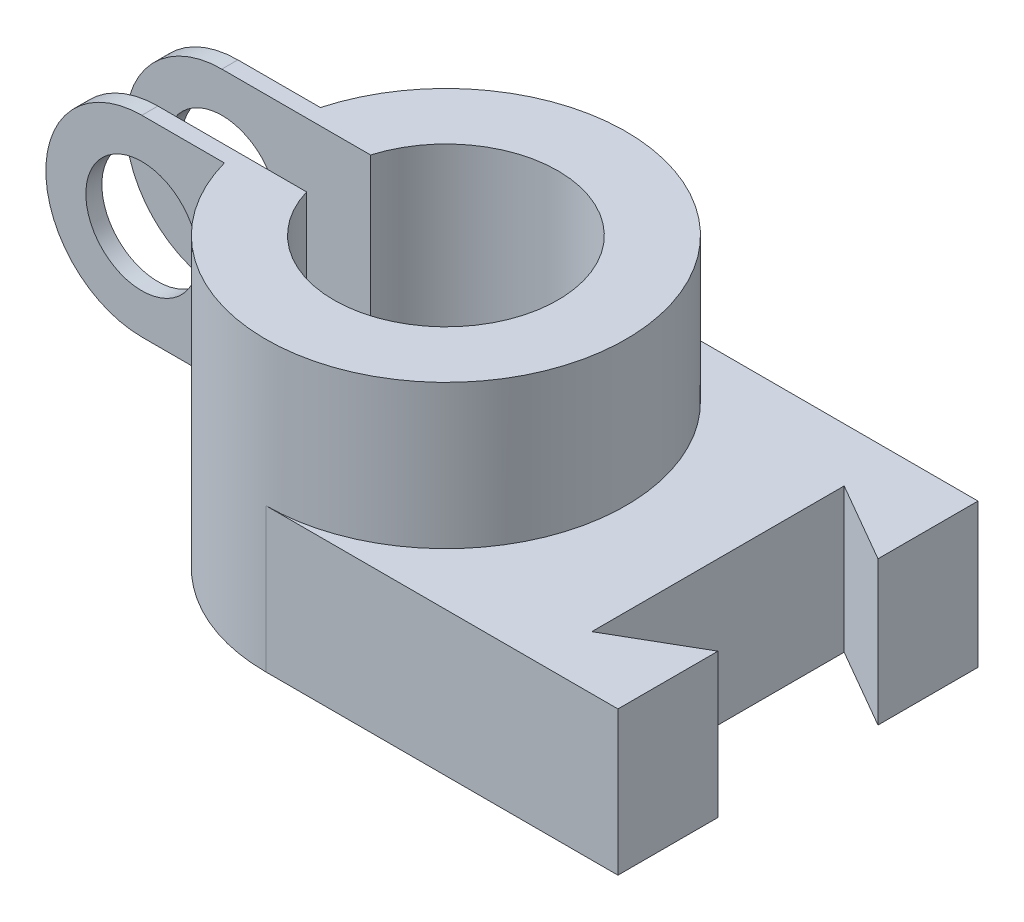
ISO-10303-21;
HEADER;
FILE_DESCRIPTION(('STEP AP214'),'2;1');
FILE_NAME('part.step','',(''),(''),'','','');
FILE_SCHEMA(('AUTOMOTIVE_DESIGN { 1 0 10303 214 1 1 1 1 }'));
ENDSEC;
DATA;
#1=APPLICATION_CONTEXT('core data for automotive mechanical design processes');
#2=APPLICATION_PROTOCOL_DEFINITION('international standard','automotive_design',2000,#1);
#3=PRODUCT_CONTEXT('',#1,'mechanical');
#4=PRODUCT('Part','Part','',(#3));
#5=PRODUCT_RELATED_PRODUCT_CATEGORY('part','',(#4));
#6=PRODUCT_DEFINITION_FORMATION('','',#4);
#7=PRODUCT_DEFINITION_CONTEXT('part definition',#1,'design');
#8=PRODUCT_DEFINITION('design','',#6,#7);
#9=PRODUCT_DEFINITION_SHAPE('','',#8);
#10=(LENGTH_UNIT() NAMED_UNIT(*) SI_UNIT(.MILLI.,.METRE.));
#11=(NAMED_UNIT(*) PLANE_ANGLE_UNIT() SI_UNIT($,.RADIAN.));
#12=(NAMED_UNIT(*) SI_UNIT($,.STERADIAN.) SOLID_ANGLE_UNIT());
#13=UNCERTAINTY_MEASURE_WITH_UNIT(LENGTH_MEASURE(1.E-05),#10,'distance_accuracy_value','');
#14=(GEOMETRIC_REPRESENTATION_CONTEXT(3) GLOBAL_UNCERTAINTY_ASSIGNED_CONTEXT((#13)) GLOBAL_UNIT_ASSIGNED_CONTEXT((#10,
#11,#12)) REPRESENTATION_CONTEXT('',''));
#15=CARTESIAN_POINT('',(0.,0.,0.));
#16=DIRECTION('',(0.,0.,1.));
#17=DIRECTION('',(1.,0.,0.));
#18=AXIS2_PLACEMENT_3D('',#15,#16,#17);
#19=CARTESIAN_POINT('',(44.,18.,0.));
#20=DIRECTION('',(1.,0.,0.));
#21=DIRECTION('',(0.,0.,-1.));
#22=AXIS2_PLACEMENT_3D('',#19,#20,#21);
#23=PLANE('',#22);
#24=DIRECTION('',(0.,1.,0.));
#25=VECTOR('',#24,1.);
#26=CARTESIAN_POINT('',(44.,0.,10.));
#27=LINE('',#26,#25);
#28=CARTESIAN_POINT('',(44.,0.,10.));
#29=VERTEX_POINT('',#28);
#30=CARTESIAN_POINT('',(44.,18.,10.));
#31=VERTEX_POINT('',#30);
#32=EDGE_CURVE('E380',#29,#31,#27,.T.);
#33=ORIENTED_EDGE('',*,*,#32,.T.);
#34=DIRECTION('',(0.,0.,1.));
#35=VECTOR('',#34,1.);
#36=CARTESIAN_POINT('',(44.,18.,0.));
#37=LINE('',#36,#35);
#38=CARTESIAN_POINT('',(44.,18.,22.5));
#39=VERTEX_POINT('',#38);
#40=EDGE_CURVE('E355',#31,#39,#37,.T.);
#41=ORIENTED_EDGE('',*,*,#40,.T.);
#42=DIRECTION('',(0.,-1.,0.));
#43=VECTOR('',#42,1.);
#44=CARTESIAN_POINT('',(44.,18.,22.5));
#45=LINE('',#44,#43);
#46=CARTESIAN_POINT('',(44.,0.,22.5));
#47=VERTEX_POINT('',#46);
#48=EDGE_CURVE('E210',#39,#47,#45,.T.);
#49=ORIENTED_EDGE('',*,*,#48,.T.);
#50=DIRECTION('',(0.,0.,1.));
#51=VECTOR('',#50,1.);
#52=CARTESIAN_POINT('',(44.,0.,0.));
#53=LINE('',#52,#51);
#54=EDGE_CURVE('E192',#29,#47,#53,.T.);
#55=ORIENTED_EDGE('',*,*,#54,.F.);
#56=EDGE_LOOP('',(#33,#41,#49,#55));
#57=FACE_BOUND('',#56,.T.);
#58=ADVANCED_FACE('F41',(#57),#23,.T.);
#59=CARTESIAN_POINT('',(0.,36.,0.));
#60=DIRECTION('',(0.,-1.,0.));
#61=DIRECTION('',(0.,0.,-1.));
#62=AXIS2_PLACEMENT_3D('',#59,#60,#61);
#63=CYLINDRICAL_SURFACE('',#62,22.5);
#64=DIRECTION('',(0.,-1.,0.));
#65=VECTOR('',#64,1.);
#66=CARTESIAN_POINT('',(-22.1415898254845,36.,-4.));
#67=LINE('',#66,#65);
#68=CARTESIAN_POINT('',(-22.1415898254845,12.,-4.));
#69=VERTEX_POINT('',#68);
#70=CARTESIAN_POINT('',(-22.1415898254845,0.,-4.));
#71=VERTEX_POINT('',#70);
#72=EDGE_CURVE('E11',#69,#71,#67,.T.);
#73=ORIENTED_EDGE('',*,*,#72,.F.);
#74=CARTESIAN_POINT('',(0.,12.,0.));
#75=DIRECTION('',(0.,-1.,0.));
#76=DIRECTION('',(0.,0.,-1.));
#77=AXIS2_PLACEMENT_3D('',#74,#75,#76);
#78=CIRCLE('',#77,22.5);
#79=CARTESIAN_POINT('',(-21.6852484422014,12.,-6.));
#80=VERTEX_POINT('',#79);
#81=EDGE_CURVE('E305',#69,#80,#78,.T.);
#82=ORIENTED_EDGE('',*,*,#81,.T.);
#83=DIRECTION('',(0.,-1.,0.));
#84=VECTOR('',#83,1.);
#85=CARTESIAN_POINT('',(-21.6852484422014,36.,-6.));
#86=LINE('',#85,#84);
#87=CARTESIAN_POINT('',(-21.6852484422014,36.,-6.));
#88=VERTEX_POINT('',#87);
#89=EDGE_CURVE('E299',#88,#80,#86,.T.);
#90=ORIENTED_EDGE('',*,*,#89,.F.);
#91=CARTESIAN_POINT('',(0.,36.,0.));
#92=DIRECTION('',(0.,1.,0.));
#93=DIRECTION('',(0.,0.,1.));
#94=AXIS2_PLACEMENT_3D('',#91,#92,#93);
#95=CIRCLE('',#94,22.5);
#96=CARTESIAN_POINT('',(-21.6852484422014,36.,6.));
#97=VERTEX_POINT('',#96);
#98=EDGE_CURVE('E219',#97,#88,#95,.T.);
#99=ORIENTED_EDGE('',*,*,#98,.F.);
#100=DIRECTION('',(0.,-1.,0.));
#101=VECTOR('',#100,1.);
#102=CARTESIAN_POINT('',(-21.6852484422014,36.,6.));
#103=LINE('',#102,#101);
#104=CARTESIAN_POINT('',(-21.6852484422014,12.,6.));
#105=VERTEX_POINT('',#104);
#106=EDGE_CURVE('E342',#97,#105,#103,.T.);
#107=ORIENTED_EDGE('',*,*,#106,.T.);
#108=CARTESIAN_POINT('',(0.,12.,0.));
#109=DIRECTION('',(0.,1.,0.));
#110=DIRECTION('',(0.,0.,1.));
#111=AXIS2_PLACEMENT_3D('',#108,#109,#110);
#112=CIRCLE('',#111,22.5);
#113=CARTESIAN_POINT('',(-22.1415898254845,12.,4.));
#114=VERTEX_POINT('',#113);
#115=EDGE_CURVE('E346',#114,#105,#112,.T.);
#116=ORIENTED_EDGE('',*,*,#115,.F.);
#117=DIRECTION('',(0.,-1.,0.));
#118=VECTOR('',#117,1.);
#119=CARTESIAN_POINT('',(-22.1415898254845,36.,4.));
#120=LINE('',#119,#118);
#121=CARTESIAN_POINT('',(-22.1415898254845,0.,4.));
#122=VERTEX_POINT('',#121);
#123=EDGE_CURVE('E234',#114,#122,#120,.T.);
#124=ORIENTED_EDGE('',*,*,#123,.T.);
#125=CARTESIAN_POINT('',(0.,0.,0.));
#126=DIRECTION('',(0.,1.,0.));
#127=DIRECTION('',(0.,0.,1.));
#128=AXIS2_PLACEMENT_3D('',#125,#126,#127);
#129=CIRCLE('',#128,22.5);
#130=CARTESIAN_POINT('',(0.,0.,22.5));
#131=VERTEX_POINT('',#130);
#132=EDGE_CURVE('E235',#122,#131,#129,.T.);
#133=ORIENTED_EDGE('',*,*,#132,.T.);
#134=DIRECTION('',(0.,-1.,0.));
#135=VECTOR('',#134,1.);
#136=CARTESIAN_POINT('',(0.,18.,22.5));
#137=LINE('',#136,#135);
#138=CARTESIAN_POINT('',(0.,18.,22.5));
#139=VERTEX_POINT('',#138);
#140=EDGE_CURVE('E214',#139,#131,#137,.T.);
#141=ORIENTED_EDGE('',*,*,#140,.F.);
#142=CARTESIAN_POINT('',(0.,18.,0.));
#143=DIRECTION('',(0.,1.,0.));
#144=DIRECTION('',(0.,0.,1.));
#145=AXIS2_PLACEMENT_3D('',#142,#143,#144);
#146=CIRCLE('',#145,22.5);
#147=CARTESIAN_POINT('',(0.,18.,-22.5));
#148=VERTEX_POINT('',#147);
#149=EDGE_CURVE('E196',#139,#148,#146,.T.);
#150=ORIENTED_EDGE('',*,*,#149,.T.);
#151=DIRECTION('',(0.,-1.,0.));
#152=VECTOR('',#151,1.);
#153=CARTESIAN_POINT('',(0.,18.,-22.5));
#154=LINE('',#153,#152);
#155=CARTESIAN_POINT('',(0.,0.,-22.5));
#156=VERTEX_POINT('',#155);
#157=EDGE_CURVE('E202',#148,#156,#154,.T.);
#158=ORIENTED_EDGE('',*,*,#157,.T.);
#159=EDGE_CURVE('E218',#156,#71,#129,.T.);
#160=ORIENTED_EDGE('',*,*,#159,.T.);
#161=EDGE_LOOP('',(#73,#82,#90,#99,#107,#116,#124,#133,#141,#150,#158,#160));
#162=FACE_BOUND('',#161,.T.);
#163=ADVANCED_FACE('F43',(#162),#63,.T.);
#164=CARTESIAN_POINT('',(0.,36.,-4.));
#165=DIRECTION('',(0.,0.,-1.));
#166=DIRECTION('',(-1.,0.,0.));
#167=AXIS2_PLACEMENT_3D('',#164,#165,#166);
#168=PLANE('',#167);
#169=DIRECTION('',(0.,-1.,0.));
#170=VECTOR('',#169,1.);
#171=CARTESIAN_POINT('',(-13.4164078649987,36.,-4.));
#172=LINE('',#171,#170);
#173=CARTESIAN_POINT('',(-13.4164078649987,36.,-4.));
#174=VERTEX_POINT('',#173);
#175=CARTESIAN_POINT('',(-13.4164078649987,0.,-4.));
#176=VERTEX_POINT('',#175);
#177=EDGE_CURVE('E50',#174,#176,#172,.T.);
#178=ORIENTED_EDGE('',*,*,#177,.F.);
#179=DIRECTION('',(1.,0.,0.));
#180=VECTOR('',#179,1.);
#181=CARTESIAN_POINT('',(0.,36.,-4.));
#182=LINE('',#181,#180);
#183=CARTESIAN_POINT('',(-32.,36.,-4.));
#184=VERTEX_POINT('',#183);
#185=EDGE_CURVE('E223',#184,#174,#182,.T.);
#186=ORIENTED_EDGE('',*,*,#185,.F.);
#187=CARTESIAN_POINT('',(-32.,24.,-4.));
#188=DIRECTION('',(0.,0.,1.));
#189=DIRECTION('',(1.,0.,0.));
#190=AXIS2_PLACEMENT_3D('',#187,#188,#189);
#191=CIRCLE('',#190,12.);
#192=CARTESIAN_POINT('',(-32.,12.,-4.));
#193=VERTEX_POINT('',#192);
#194=EDGE_CURVE('E281',#184,#193,#191,.T.);
#195=ORIENTED_EDGE('',*,*,#194,.T.);
#196=DIRECTION('',(1.,0.,0.));
#197=VECTOR('',#196,1.);
#198=CARTESIAN_POINT('',(-32.,12.,-4.));
#199=LINE('',#198,#197);
#200=EDGE_CURVE('E64',#193,#69,#199,.T.);
#201=ORIENTED_EDGE('',*,*,#200,.T.);
#202=ORIENTED_EDGE('',*,*,#72,.T.);
#203=DIRECTION('',(1.,0.,0.));
#204=VECTOR('',#203,1.);
#205=CARTESIAN_POINT('',(0.,0.,-4.));
#206=LINE('',#205,#204);
#207=EDGE_CURVE('E238',#71,#176,#206,.T.);
#208=ORIENTED_EDGE('',*,*,#207,.T.);
#209=EDGE_LOOP('',(#178,#186,#195,#201,#202,#208));
#210=FACE_BOUND('',#209,.T.);
#211=CARTESIAN_POINT('',(-32.,24.,-4.));
#212=DIRECTION('',(0.,0.,1.));
#213=DIRECTION('',(1.,0.,0.));
#214=AXIS2_PLACEMENT_3D('',#211,#212,#213);
#215=CIRCLE('',#214,7.);
#216=CARTESIAN_POINT('',(-25.,24.,-4.));
#217=VERTEX_POINT('',#216);
#218=EDGE_CURVE('E291',#217,#217,#215,.T.);
#219=ORIENTED_EDGE('',*,*,#218,.F.);
#220=EDGE_LOOP('',(#219));
#221=FACE_BOUND('',#220,.T.);
#222=ADVANCED_FACE('F261',(#210,#221),#168,.F.);
#223=CARTESIAN_POINT('',(0.,36.,0.));
#224=DIRECTION('',(0.,-1.,0.));
#225=DIRECTION('',(0.,0.,-1.));
#226=AXIS2_PLACEMENT_3D('',#223,#224,#225);
#227=CYLINDRICAL_SURFACE('',#226,14.);
#228=CARTESIAN_POINT('',(0.,0.,0.));
#229=DIRECTION('',(0.,1.,0.));
#230=DIRECTION('',(0.,0.,1.));
#231=AXIS2_PLACEMENT_3D('',#228,#229,#230);
#232=CIRCLE('',#231,14.);
#233=CARTESIAN_POINT('',(-13.4164078649987,0.,4.));
#234=VERTEX_POINT('',#233);
#235=EDGE_CURVE('E242',#234,#176,#232,.T.);
#236=ORIENTED_EDGE('',*,*,#235,.F.);
#237=DIRECTION('',(0.,-1.,0.));
#238=VECTOR('',#237,1.);
#239=CARTESIAN_POINT('',(-13.4164078649987,36.,4.));
#240=LINE('',#239,#238);
#241=CARTESIAN_POINT('',(-13.4164078649987,36.,4.));
#242=VERTEX_POINT('',#241);
#243=EDGE_CURVE('E251',#242,#234,#240,.T.);
#244=ORIENTED_EDGE('',*,*,#243,.F.);
#245=CARTESIAN_POINT('',(0.,36.,0.));
#246=DIRECTION('',(0.,1.,0.));
#247=DIRECTION('',(0.,0.,1.));
#248=AXIS2_PLACEMENT_3D('',#245,#246,#247);
#249=CIRCLE('',#248,14.);
#250=EDGE_CURVE('E227',#242,#174,#249,.T.);
#251=ORIENTED_EDGE('',*,*,#250,.T.);
#252=ORIENTED_EDGE('',*,*,#177,.T.);
#253=EDGE_LOOP('',(#236,#244,#251,#252));
#254=FACE_BOUND('',#253,.T.);
#255=ADVANCED_FACE('F257',(#254),#227,.F.);
#256=CARTESIAN_POINT('',(0.,36.,4.));
#257=DIRECTION('',(0.,0.,-1.));
#258=DIRECTION('',(-1.,0.,0.));
#259=AXIS2_PLACEMENT_3D('',#256,#257,#258);
#260=PLANE('',#259);
#261=ORIENTED_EDGE('',*,*,#123,.F.);
#262=DIRECTION('',(1.,0.,0.));
#263=VECTOR('',#262,1.);
#264=CARTESIAN_POINT('',(-32.,12.,4.));
#265=LINE('',#264,#263);
#266=CARTESIAN_POINT('',(-32.,12.,4.));
#267=VERTEX_POINT('',#266);
#268=EDGE_CURVE('E323',#267,#114,#265,.T.);
#269=ORIENTED_EDGE('',*,*,#268,.F.);
#270=CARTESIAN_POINT('',(-32.,24.,4.));
#271=DIRECTION('',(0.,0.,1.));
#272=DIRECTION('',(1.,0.,0.));
#273=AXIS2_PLACEMENT_3D('',#270,#271,#272);
#274=CIRCLE('',#273,12.);
#275=CARTESIAN_POINT('',(-32.,36.,4.));
#276=VERTEX_POINT('',#275);
#277=EDGE_CURVE('E314',#276,#267,#274,.T.);
#278=ORIENTED_EDGE('',*,*,#277,.F.);
#279=DIRECTION('',(1.,0.,0.));
#280=VECTOR('',#279,1.);
#281=CARTESIAN_POINT('',(0.,36.,4.));
#282=LINE('',#281,#280);
#283=EDGE_CURVE('E231',#276,#242,#282,.T.);
#284=ORIENTED_EDGE('',*,*,#283,.T.);
#285=ORIENTED_EDGE('',*,*,#243,.T.);
#286=DIRECTION('',(1.,0.,0.));
#287=VECTOR('',#286,1.);
#288=CARTESIAN_POINT('',(0.,0.,4.));
#289=LINE('',#288,#287);
#290=EDGE_CURVE('E224',#122,#234,#289,.T.);
#291=ORIENTED_EDGE('',*,*,#290,.F.);
#292=EDGE_LOOP('',(#261,#269,#278,#284,#285,#291));
#293=FACE_BOUND('',#292,.T.);
#294=CARTESIAN_POINT('',(-32.,24.,4.));
#295=DIRECTION('',(0.,0.,1.));
#296=DIRECTION('',(1.,0.,0.));
#297=AXIS2_PLACEMENT_3D('',#294,#295,#296);
#298=CIRCLE('',#297,7.);
#299=CARTESIAN_POINT('',(-25.,24.,4.));
#300=VERTEX_POINT('',#299);
#301=EDGE_CURVE('E309',#300,#300,#298,.T.);
#302=ORIENTED_EDGE('',*,*,#301,.T.);
#303=EDGE_LOOP('',(#302));
#304=FACE_BOUND('',#303,.T.);
#305=ADVANCED_FACE('F270',(#293,#304),#260,.T.);
#306=CARTESIAN_POINT('',(0.,36.,0.));
#307=DIRECTION('',(0.,1.,0.));
#308=DIRECTION('',(0.,0.,1.));
#309=AXIS2_PLACEMENT_3D('',#306,#307,#308);
#310=PLANE('',#309);
#311=ORIENTED_EDGE('',*,*,#185,.T.);
#312=ORIENTED_EDGE('',*,*,#250,.F.);
#313=ORIENTED_EDGE('',*,*,#283,.F.);
#314=DIRECTION('',(0.,0.,-1.));
#315=VECTOR('',#314,1.);
#316=CARTESIAN_POINT('',(-32.,36.,6.));
#317=LINE('',#316,#315);
#318=CARTESIAN_POINT('',(-32.,36.,6.));
#319=VERTEX_POINT('',#318);
#320=EDGE_CURVE('E330',#319,#276,#317,.T.);
#321=ORIENTED_EDGE('',*,*,#320,.F.);
#322=DIRECTION('',(-1.,0.,0.));
#323=VECTOR('',#322,1.);
#324=CARTESIAN_POINT('',(-32.,36.,6.));
#325=LINE('',#324,#323);
#326=EDGE_CURVE('E327',#97,#319,#325,.T.);
#327=ORIENTED_EDGE('',*,*,#326,.F.);
#328=ORIENTED_EDGE('',*,*,#98,.T.);
#329=DIRECTION('',(-1.,0.,0.));
#330=VECTOR('',#329,1.);
#331=CARTESIAN_POINT('',(-32.,36.,-6.));
#332=LINE('',#331,#330);
#333=CARTESIAN_POINT('',(-32.,36.,-6.));
#334=VERTEX_POINT('',#333);
#335=EDGE_CURVE('E294',#88,#334,#332,.T.);
#336=ORIENTED_EDGE('',*,*,#335,.T.);
#337=DIRECTION('',(0.,0.,1.));
#338=VECTOR('',#337,1.);
#339=CARTESIAN_POINT('',(-32.,36.,-6.));
#340=LINE('',#339,#338);
#341=EDGE_CURVE('E279',#334,#184,#340,.T.);
#342=ORIENTED_EDGE('',*,*,#341,.T.);
#343=EDGE_LOOP('',(#311,#312,#313,#321,#327,#328,#336,#342));
#344=FACE_BOUND('',#343,.T.);
#345=ADVANCED_FACE('F274',(#344),#310,.T.);
#346=CARTESIAN_POINT('',(0.,0.,0.));
#347=DIRECTION('',(0.,1.,0.));
#348=DIRECTION('',(0.,0.,1.));
#349=AXIS2_PLACEMENT_3D('',#346,#347,#348);
#350=PLANE('',#349);
#351=DIRECTION('',(0.,0.,1.));
#352=VECTOR('',#351,1.);
#353=CARTESIAN_POINT('',(34.,0.,-15.7735026918963));
#354=LINE('',#353,#352);
#355=CARTESIAN_POINT('',(34.,0.,-15.7735026918963));
#356=VERTEX_POINT('',#355);
#357=CARTESIAN_POINT('',(34.,0.,15.7735026918963));
#358=VERTEX_POINT('',#357);
#359=EDGE_CURVE('E174',#356,#358,#354,.T.);
#360=ORIENTED_EDGE('',*,*,#359,.T.);
#361=DIRECTION('',(0.866025403784436,0.,-0.500000000000004));
#362=VECTOR('',#361,1.);
#363=CARTESIAN_POINT('',(44.,0.,10.));
#364=LINE('',#363,#362);
#365=EDGE_CURVE('E186',#358,#29,#364,.T.);
#366=ORIENTED_EDGE('',*,*,#365,.T.);
#367=ORIENTED_EDGE('',*,*,#54,.T.);
#368=DIRECTION('',(1.,0.,0.));
#369=VECTOR('',#368,1.);
#370=CARTESIAN_POINT('',(0.,0.,22.5));
#371=LINE('',#370,#369);
#372=EDGE_CURVE('E198',#131,#47,#371,.T.);
#373=ORIENTED_EDGE('',*,*,#372,.F.);
#374=ORIENTED_EDGE('',*,*,#132,.F.);
#375=ORIENTED_EDGE('',*,*,#290,.T.);
#376=ORIENTED_EDGE('',*,*,#235,.T.);
#377=ORIENTED_EDGE('',*,*,#207,.F.);
#378=ORIENTED_EDGE('',*,*,#159,.F.);
#379=DIRECTION('',(1.,0.,0.));
#380=VECTOR('',#379,1.);
#381=CARTESIAN_POINT('',(0.,0.,-22.5));
#382=LINE('',#381,#380);
#383=CARTESIAN_POINT('',(44.,0.,-22.5));
#384=VERTEX_POINT('',#383);
#385=EDGE_CURVE('E190',#156,#384,#382,.T.);
#386=ORIENTED_EDGE('',*,*,#385,.T.);
#387=CARTESIAN_POINT('',(44.,0.,-10.));
#388=VERTEX_POINT('',#387);
#389=EDGE_CURVE('E181',#384,#388,#53,.T.);
#390=ORIENTED_EDGE('',*,*,#389,.T.);
#391=DIRECTION('',(-0.866025403784436,0.,-0.500000000000004));
#392=VECTOR('',#391,1.);
#393=CARTESIAN_POINT('',(44.,0.,-10.));
#394=LINE('',#393,#392);
#395=EDGE_CURVE('E166',#388,#356,#394,.T.);
#396=ORIENTED_EDGE('',*,*,#395,.T.);
#397=EDGE_LOOP('',(#360,#366,#367,#373,#374,#375,#376,#377,#378,#386,#390,#396));
#398=FACE_BOUND('',#397,.T.);
#399=ADVANCED_FACE('F188',(#398),#350,.F.);
#400=CARTESIAN_POINT('',(0.,18.,22.5));
#401=DIRECTION('',(0.,0.,-1.));
#402=DIRECTION('',(-1.,0.,0.));
#403=AXIS2_PLACEMENT_3D('',#400,#401,#402);
#404=PLANE('',#403);
#405=ORIENTED_EDGE('',*,*,#372,.T.);
#406=ORIENTED_EDGE('',*,*,#48,.F.);
#407=DIRECTION('',(1.,0.,0.));
#408=VECTOR('',#407,1.);
#409=CARTESIAN_POINT('',(0.,18.,22.5));
#410=LINE('',#409,#408);
#411=EDGE_CURVE('E351',#139,#39,#410,.T.);
#412=ORIENTED_EDGE('',*,*,#411,.F.);
#413=ORIENTED_EDGE('',*,*,#140,.T.);
#414=EDGE_LOOP('',(#405,#406,#412,#413));
#415=FACE_BOUND('',#414,.T.);
#416=ADVANCED_FACE('F430',(#415),#404,.F.);
#417=DIRECTION('',(0.,1.,0.));
#418=VECTOR('',#417,1.);
#419=CARTESIAN_POINT('',(44.,0.,-10.));
#420=LINE('',#419,#418);
#421=CARTESIAN_POINT('',(44.,18.,-10.));
#422=VERTEX_POINT('',#421);
#423=EDGE_CURVE('E57',#388,#422,#420,.T.);
#424=ORIENTED_EDGE('',*,*,#423,.F.);
#425=ORIENTED_EDGE('',*,*,#389,.F.);
#426=DIRECTION('',(0.,-1.,0.));
#427=VECTOR('',#426,1.);
#428=CARTESIAN_POINT('',(44.,18.,-22.5));
#429=LINE('',#428,#427);
#430=CARTESIAN_POINT('',(44.,18.,-22.5));
#431=VERTEX_POINT('',#430);
#432=EDGE_CURVE('E206',#431,#384,#429,.T.);
#433=ORIENTED_EDGE('',*,*,#432,.F.);
#434=EDGE_CURVE('E184',#431,#422,#37,.T.);
#435=ORIENTED_EDGE('',*,*,#434,.T.);
#436=EDGE_LOOP('',(#424,#425,#433,#435));
#437=FACE_BOUND('',#436,.T.);
#438=ADVANCED_FACE('F180',(#437),#23,.T.);
#439=CARTESIAN_POINT('',(0.,18.,-22.5));
#440=DIRECTION('',(0.,0.,-1.));
#441=DIRECTION('',(-1.,0.,0.));
#442=AXIS2_PLACEMENT_3D('',#439,#440,#441);
#443=PLANE('',#442);
#444=ORIENTED_EDGE('',*,*,#385,.F.);
#445=ORIENTED_EDGE('',*,*,#157,.F.);
#446=DIRECTION('',(1.,0.,0.));
#447=VECTOR('',#446,1.);
#448=CARTESIAN_POINT('',(0.,18.,-22.5));
#449=LINE('',#448,#447);
#450=EDGE_CURVE('E207',#148,#431,#449,.T.);
#451=ORIENTED_EDGE('',*,*,#450,.T.);
#452=ORIENTED_EDGE('',*,*,#432,.T.);
#453=EDGE_LOOP('',(#444,#445,#451,#452));
#454=FACE_BOUND('',#453,.T.);
#455=ADVANCED_FACE('F362',(#454),#443,.T.);
#456=CARTESIAN_POINT('',(0.,18.,0.));
#457=DIRECTION('',(0.,1.,0.));
#458=DIRECTION('',(0.,0.,1.));
#459=AXIS2_PLACEMENT_3D('',#456,#457,#458);
#460=PLANE('',#459);
#461=DIRECTION('',(0.866025403784436,0.,-0.500000000000004));
#462=VECTOR('',#461,1.);
#463=CARTESIAN_POINT('',(44.,18.,10.));
#464=LINE('',#463,#462);
#465=CARTESIAN_POINT('',(34.,18.,15.7735026918963));
#466=VERTEX_POINT('',#465);
#467=EDGE_CURVE('E175',#466,#31,#464,.T.);
#468=ORIENTED_EDGE('',*,*,#467,.F.);
#469=DIRECTION('',(0.,0.,1.));
#470=VECTOR('',#469,1.);
#471=CARTESIAN_POINT('',(34.,18.,-15.7735026918963));
#472=LINE('',#471,#470);
#473=CARTESIAN_POINT('',(34.,18.,-15.7735026918963));
#474=VERTEX_POINT('',#473);
#475=EDGE_CURVE('E370',#474,#466,#472,.T.);
#476=ORIENTED_EDGE('',*,*,#475,.F.);
#477=DIRECTION('',(-0.866025403784436,0.,-0.500000000000004));
#478=VECTOR('',#477,1.);
#479=CARTESIAN_POINT('',(44.,18.,-10.));
#480=LINE('',#479,#478);
#481=EDGE_CURVE('E368',#422,#474,#480,.T.);
#482=ORIENTED_EDGE('',*,*,#481,.F.);
#483=ORIENTED_EDGE('',*,*,#434,.F.);
#484=ORIENTED_EDGE('',*,*,#450,.F.);
#485=ORIENTED_EDGE('',*,*,#149,.F.);
#486=ORIENTED_EDGE('',*,*,#411,.T.);
#487=ORIENTED_EDGE('',*,*,#40,.F.);
#488=EDGE_LOOP('',(#468,#476,#482,#483,#484,#485,#486,#487));
#489=FACE_BOUND('',#488,.T.);
#490=ADVANCED_FACE('F366',(#489),#460,.T.);
#491=CARTESIAN_POINT('',(-32.,12.,6.));
#492=DIRECTION('',(0.,1.,0.));
#493=DIRECTION('',(0.,0.,1.));
#494=AXIS2_PLACEMENT_3D('',#491,#492,#493);
#495=PLANE('',#494);
#496=ORIENTED_EDGE('',*,*,#268,.T.);
#497=ORIENTED_EDGE('',*,*,#115,.T.);
#498=DIRECTION('',(1.,0.,0.));
#499=VECTOR('',#498,1.);
#500=CARTESIAN_POINT('',(-32.,12.,6.));
#501=LINE('',#500,#499);
#502=CARTESIAN_POINT('',(-32.,12.,6.));
#503=VERTEX_POINT('',#502);
#504=EDGE_CURVE('E322',#503,#105,#501,.T.);
#505=ORIENTED_EDGE('',*,*,#504,.F.);
#506=DIRECTION('',(0.,0.,-1.));
#507=VECTOR('',#506,1.);
#508=CARTESIAN_POINT('',(-32.,12.,6.));
#509=LINE('',#508,#507);
#510=EDGE_CURVE('E338',#503,#267,#509,.T.);
#511=ORIENTED_EDGE('',*,*,#510,.T.);
#512=EDGE_LOOP('',(#496,#497,#505,#511));
#513=FACE_BOUND('',#512,.T.);
#514=ADVANCED_FACE('F490',(#513),#495,.F.);
#515=CARTESIAN_POINT('',(-32.,24.,6.));
#516=DIRECTION('',(0.,0.,1.));
#517=DIRECTION('',(1.,0.,0.));
#518=AXIS2_PLACEMENT_3D('',#515,#516,#517);
#519=PLANE('',#518);
#520=CARTESIAN_POINT('',(-32.,24.,6.));
#521=DIRECTION('',(0.,0.,1.));
#522=DIRECTION('',(1.,0.,0.));
#523=AXIS2_PLACEMENT_3D('',#520,#521,#522);
#524=CIRCLE('',#523,7.);
#525=CARTESIAN_POINT('',(-25.,24.,6.));
#526=VERTEX_POINT('',#525);
#527=EDGE_CURVE('E310',#526,#526,#524,.T.);
#528=ORIENTED_EDGE('',*,*,#527,.F.);
#529=EDGE_LOOP('',(#528));
#530=FACE_BOUND('',#529,.T.);
#531=ORIENTED_EDGE('',*,*,#106,.F.);
#532=ORIENTED_EDGE('',*,*,#326,.T.);
#533=CARTESIAN_POINT('',(-32.,24.,6.));
#534=DIRECTION('',(0.,0.,1.));
#535=DIRECTION('',(1.,0.,0.));
#536=AXIS2_PLACEMENT_3D('',#533,#534,#535);
#537=CIRCLE('',#536,12.);
#538=EDGE_CURVE('E318',#319,#503,#537,.T.);
#539=ORIENTED_EDGE('',*,*,#538,.T.);
#540=ORIENTED_EDGE('',*,*,#504,.T.);
#541=EDGE_LOOP('',(#531,#532,#539,#540));
#542=FACE_BOUND('',#541,.T.);
#543=ADVANCED_FACE('F535',(#530,#542),#519,.T.);
#544=CARTESIAN_POINT('',(-32.,24.,6.));
#545=DIRECTION('',(0.,0.,-1.));
#546=DIRECTION('',(-1.,0.,0.));
#547=AXIS2_PLACEMENT_3D('',#544,#545,#546);
#548=CYLINDRICAL_SURFACE('',#547,12.);
#549=ORIENTED_EDGE('',*,*,#277,.T.);
#550=ORIENTED_EDGE('',*,*,#510,.F.);
#551=ORIENTED_EDGE('',*,*,#538,.F.);
#552=ORIENTED_EDGE('',*,*,#320,.T.);
#553=EDGE_LOOP('',(#549,#550,#551,#552));
#554=FACE_BOUND('',#553,.T.);
#555=ADVANCED_FACE('F417',(#554),#548,.T.);
#556=CARTESIAN_POINT('',(-32.,24.,6.));
#557=DIRECTION('',(0.,0.,-1.));
#558=DIRECTION('',(-1.,0.,0.));
#559=AXIS2_PLACEMENT_3D('',#556,#557,#558);
#560=CYLINDRICAL_SURFACE('',#559,7.);
#561=ORIENTED_EDGE('',*,*,#527,.T.);
#562=EDGE_LOOP('',(#561));
#563=FACE_BOUND('',#562,.T.);
#564=ORIENTED_EDGE('',*,*,#301,.F.);
#565=EDGE_LOOP('',(#564));
#566=FACE_BOUND('',#565,.T.);
#567=ADVANCED_FACE('F409',(#563,#566),#560,.F.);
#568=CARTESIAN_POINT('',(-32.,12.,-6.));
#569=DIRECTION('',(0.,-1.,0.));
#570=DIRECTION('',(0.,0.,-1.));
#571=AXIS2_PLACEMENT_3D('',#568,#569,#570);
#572=PLANE('',#571);
#573=ORIENTED_EDGE('',*,*,#81,.F.);
#574=ORIENTED_EDGE('',*,*,#200,.F.);
#575=DIRECTION('',(0.,0.,1.));
#576=VECTOR('',#575,1.);
#577=CARTESIAN_POINT('',(-32.,12.,-6.));
#578=LINE('',#577,#576);
#579=CARTESIAN_POINT('',(-32.,12.,-6.));
#580=VERTEX_POINT('',#579);
#581=EDGE_CURVE('E300',#580,#193,#578,.T.);
#582=ORIENTED_EDGE('',*,*,#581,.F.);
#583=DIRECTION('',(1.,0.,0.));
#584=VECTOR('',#583,1.);
#585=CARTESIAN_POINT('',(-32.,12.,-6.));
#586=LINE('',#585,#584);
#587=EDGE_CURVE('E394',#580,#80,#586,.T.);
#588=ORIENTED_EDGE('',*,*,#587,.T.);
#589=EDGE_LOOP('',(#573,#574,#582,#588));
#590=FACE_BOUND('',#589,.T.);
#591=ADVANCED_FACE('F407',(#590),#572,.T.);
#592=CARTESIAN_POINT('',(-32.,24.,-6.));
#593=DIRECTION('',(0.,0.,1.));
#594=DIRECTION('',(1.,0.,0.));
#595=AXIS2_PLACEMENT_3D('',#592,#593,#594);
#596=PLANE('',#595);
#597=CARTESIAN_POINT('',(-32.,24.,-6.));
#598=DIRECTION('',(0.,0.,1.));
#599=DIRECTION('',(1.,0.,0.));
#600=AXIS2_PLACEMENT_3D('',#597,#598,#599);
#601=CIRCLE('',#600,7.);
#602=CARTESIAN_POINT('',(-25.,24.,-6.));
#603=VERTEX_POINT('',#602);
#604=EDGE_CURVE('E284',#603,#603,#601,.T.);
#605=ORIENTED_EDGE('',*,*,#604,.T.);
#606=EDGE_LOOP('',(#605));
#607=FACE_BOUND('',#606,.T.);
#608=ORIENTED_EDGE('',*,*,#335,.F.);
#609=ORIENTED_EDGE('',*,*,#89,.T.);
#610=ORIENTED_EDGE('',*,*,#587,.F.);
#611=CARTESIAN_POINT('',(-32.,24.,-6.));
#612=DIRECTION('',(0.,0.,1.));
#613=DIRECTION('',(1.,0.,0.));
#614=AXIS2_PLACEMENT_3D('',#611,#612,#613);
#615=CIRCLE('',#614,12.);
#616=EDGE_CURVE('E288',#334,#580,#615,.T.);
#617=ORIENTED_EDGE('',*,*,#616,.F.);
#618=EDGE_LOOP('',(#608,#609,#610,#617));
#619=FACE_BOUND('',#618,.T.);
#620=ADVANCED_FACE('F405',(#607,#619),#596,.F.);
#621=CARTESIAN_POINT('',(-32.,24.,-6.));
#622=DIRECTION('',(0.,0.,1.));
#623=DIRECTION('',(1.,0.,0.));
#624=AXIS2_PLACEMENT_3D('',#621,#622,#623);
#625=CYLINDRICAL_SURFACE('',#624,12.);
#626=ORIENTED_EDGE('',*,*,#194,.F.);
#627=ORIENTED_EDGE('',*,*,#341,.F.);
#628=ORIENTED_EDGE('',*,*,#616,.T.);
#629=ORIENTED_EDGE('',*,*,#581,.T.);
#630=EDGE_LOOP('',(#626,#627,#628,#629));
#631=FACE_BOUND('',#630,.T.);
#632=ADVANCED_FACE('F404',(#631),#625,.T.);
#633=CARTESIAN_POINT('',(-32.,24.,-6.));
#634=DIRECTION('',(0.,0.,1.));
#635=DIRECTION('',(1.,0.,0.));
#636=AXIS2_PLACEMENT_3D('',#633,#634,#635);
#637=CYLINDRICAL_SURFACE('',#636,7.);
#638=ORIENTED_EDGE('',*,*,#604,.F.);
#639=EDGE_LOOP('',(#638));
#640=FACE_BOUND('',#639,.T.);
#641=ORIENTED_EDGE('',*,*,#218,.T.);
#642=EDGE_LOOP('',(#641));
#643=FACE_BOUND('',#642,.T.);
#644=ADVANCED_FACE('F502',(#640,#643),#637,.F.);
#645=CARTESIAN_POINT('',(44.,0.,10.));
#646=DIRECTION('',(0.500000000000004,0.,0.866025403784436));
#647=DIRECTION('',(0.866025403784436,0.,-0.500000000000004));
#648=AXIS2_PLACEMENT_3D('',#645,#646,#647);
#649=PLANE('',#648);
#650=ORIENTED_EDGE('',*,*,#467,.T.);
#651=ORIENTED_EDGE('',*,*,#32,.F.);
#652=ORIENTED_EDGE('',*,*,#365,.F.);
#653=DIRECTION('',(0.,1.,0.));
#654=VECTOR('',#653,1.);
#655=CARTESIAN_POINT('',(34.,0.,15.7735026918963));
#656=LINE('',#655,#654);
#657=EDGE_CURVE('E384',#358,#466,#656,.T.);
#658=ORIENTED_EDGE('',*,*,#657,.T.);
#659=EDGE_LOOP('',(#650,#651,#652,#658));
#660=FACE_BOUND('',#659,.T.);
#661=ADVANCED_FACE('F496',(#660),#649,.F.);
#662=CARTESIAN_POINT('',(34.,0.,-15.7735026918963));
#663=DIRECTION('',(-1.,0.,0.));
#664=DIRECTION('',(0.,0.,1.));
#665=AXIS2_PLACEMENT_3D('',#662,#663,#664);
#666=PLANE('',#665);
#667=ORIENTED_EDGE('',*,*,#475,.T.);
#668=ORIENTED_EDGE('',*,*,#657,.F.);
#669=ORIENTED_EDGE('',*,*,#359,.F.);
#670=DIRECTION('',(0.,1.,0.));
#671=VECTOR('',#670,1.);
#672=CARTESIAN_POINT('',(34.,0.,-15.7735026918963));
#673=LINE('',#672,#671);
#674=EDGE_CURVE('E168',#356,#474,#673,.T.);
#675=ORIENTED_EDGE('',*,*,#674,.T.);
#676=EDGE_LOOP('',(#667,#668,#669,#675));
#677=FACE_BOUND('',#676,.T.);
#678=ADVANCED_FACE('F501',(#677),#666,.F.);
#679=CARTESIAN_POINT('',(44.,0.,-10.));
#680=DIRECTION('',(0.500000000000004,0.,-0.866025403784436));
#681=DIRECTION('',(-0.866025403784436,0.,-0.500000000000004));
#682=AXIS2_PLACEMENT_3D('',#679,#680,#681);
#683=PLANE('',#682);
#684=ORIENTED_EDGE('',*,*,#481,.T.);
#685=ORIENTED_EDGE('',*,*,#674,.F.);
#686=ORIENTED_EDGE('',*,*,#395,.F.);
#687=ORIENTED_EDGE('',*,*,#423,.T.);
#688=EDGE_LOOP('',(#684,#685,#686,#687));
#689=FACE_BOUND('',#688,.T.);
#690=ADVANCED_FACE('F167',(#689),#683,.F.);
#691=CLOSED_SHELL('',(#58,#163,#222,#255,#305,#345,#399,#416,#438,#455,#490,#514,#543,#555,#567,
#591,#620,#632,#644,#661,#678,#690));
#692=MANIFOLD_SOLID_BREP('B2',#691);
#693=ADVANCED_BREP_SHAPE_REPRESENTATION('',(#18,#692),#14);
#694=SHAPE_DEFINITION_REPRESENTATION(#9,#693);
ENDSEC;
END-ISO-10303-21;
